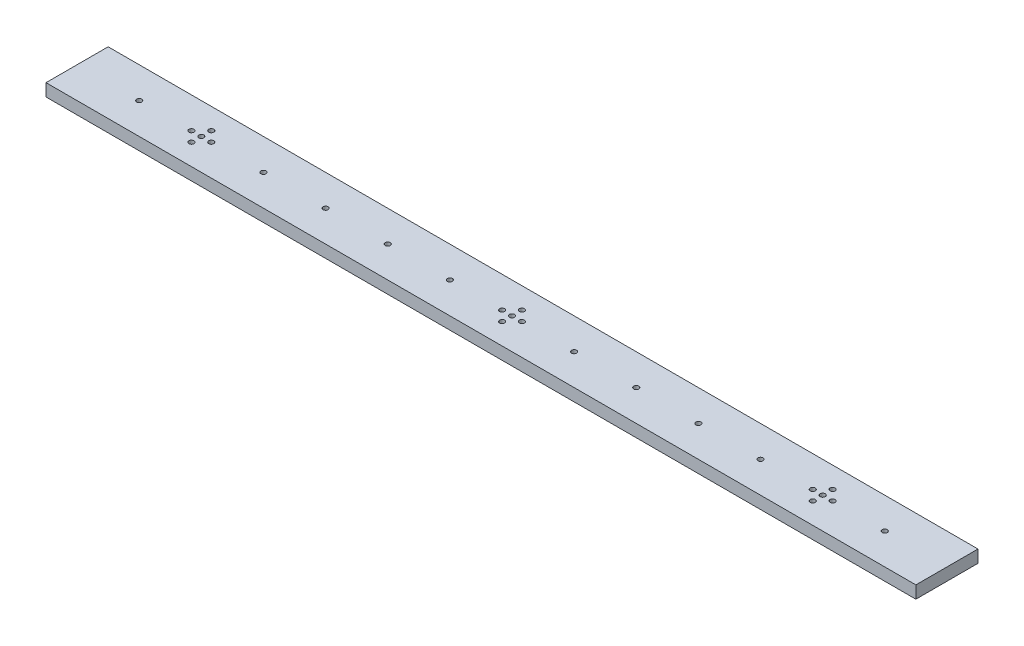
ISO-10303-21;
HEADER;
FILE_DESCRIPTION(('STEP AP214'),'2;1');
FILE_NAME('part.step','',(''),(''),'','','');
FILE_SCHEMA(('AUTOMOTIVE_DESIGN { 1 0 10303 214 1 1 1 1 }'));
ENDSEC;
DATA;
#1=APPLICATION_CONTEXT('core data for automotive mechanical design processes');
#2=APPLICATION_PROTOCOL_DEFINITION('international standard','automotive_design',2000,#1);
#3=PRODUCT_CONTEXT('',#1,'mechanical');
#4=PRODUCT('Part','Part','',(#3));
#5=PRODUCT_RELATED_PRODUCT_CATEGORY('part','',(#4));
#6=PRODUCT_DEFINITION_FORMATION('','',#4);
#7=PRODUCT_DEFINITION_CONTEXT('part definition',#1,'design');
#8=PRODUCT_DEFINITION('design','',#6,#7);
#9=PRODUCT_DEFINITION_SHAPE('','',#8);
#10=(LENGTH_UNIT() NAMED_UNIT(*) SI_UNIT(.MILLI.,.METRE.));
#11=(NAMED_UNIT(*) PLANE_ANGLE_UNIT() SI_UNIT($,.RADIAN.));
#12=(NAMED_UNIT(*) SI_UNIT($,.STERADIAN.) SOLID_ANGLE_UNIT());
#13=UNCERTAINTY_MEASURE_WITH_UNIT(LENGTH_MEASURE(1.E-05),#10,'distance_accuracy_value','');
#14=(GEOMETRIC_REPRESENTATION_CONTEXT(3) GLOBAL_UNCERTAINTY_ASSIGNED_CONTEXT((#13)) GLOBAL_UNIT_ASSIGNED_CONTEXT((#10,
#11,#12)) REPRESENTATION_CONTEXT('',''));
#15=CARTESIAN_POINT('',(0.,0.,0.));
#16=DIRECTION('',(0.,0.,1.));
#17=DIRECTION('',(1.,0.,0.));
#18=AXIS2_PLACEMENT_3D('',#15,#16,#17);
#19=CARTESIAN_POINT('',(350.,10.,-25.));
#20=DIRECTION('',(-1.,0.,0.));
#21=DIRECTION('',(0.,0.,1.));
#22=AXIS2_PLACEMENT_3D('',#19,#20,#21);
#23=PLANE('',#22);
#24=DIRECTION('',(0.,0.,-1.));
#25=VECTOR('',#24,1.);
#26=CARTESIAN_POINT('',(350.,0.,-25.));
#27=LINE('',#26,#25);
#28=CARTESIAN_POINT('',(350.,0.,25.));
#29=VERTEX_POINT('',#28);
#30=CARTESIAN_POINT('',(350.,0.,-25.));
#31=VERTEX_POINT('',#30);
#32=EDGE_CURVE('E107',#29,#31,#27,.T.);
#33=ORIENTED_EDGE('',*,*,#32,.T.);
#34=DIRECTION('',(0.,-1.,0.));
#35=VECTOR('',#34,1.);
#36=CARTESIAN_POINT('',(350.,10.,-25.));
#37=LINE('',#36,#35);
#38=CARTESIAN_POINT('',(350.,10.,-25.));
#39=VERTEX_POINT('',#38);
#40=EDGE_CURVE('E11',#39,#31,#37,.T.);
#41=ORIENTED_EDGE('',*,*,#40,.F.);
#42=DIRECTION('',(0.,0.,-1.));
#43=VECTOR('',#42,1.);
#44=CARTESIAN_POINT('',(350.,10.,-25.));
#45=LINE('',#44,#43);
#46=CARTESIAN_POINT('',(350.,10.,25.));
#47=VERTEX_POINT('',#46);
#48=EDGE_CURVE('E91',#47,#39,#45,.T.);
#49=ORIENTED_EDGE('',*,*,#48,.F.);
#50=DIRECTION('',(0.,-1.,0.));
#51=VECTOR('',#50,1.);
#52=CARTESIAN_POINT('',(350.,10.,25.));
#53=LINE('',#52,#51);
#54=EDGE_CURVE('E103',#47,#29,#53,.T.);
#55=ORIENTED_EDGE('',*,*,#54,.T.);
#56=EDGE_LOOP('',(#33,#41,#49,#55));
#57=FACE_BOUND('',#56,.T.);
#58=ADVANCED_FACE('F39',(#57),#23,.F.);
#59=CARTESIAN_POINT('',(-350.,10.,-25.));
#60=DIRECTION('',(0.,0.,1.));
#61=DIRECTION('',(1.,0.,0.));
#62=AXIS2_PLACEMENT_3D('',#59,#60,#61);
#63=PLANE('',#62);
#64=DIRECTION('',(-1.,0.,0.));
#65=VECTOR('',#64,1.);
#66=CARTESIAN_POINT('',(-350.,0.,-25.));
#67=LINE('',#66,#65);
#68=CARTESIAN_POINT('',(-350.,0.,-25.));
#69=VERTEX_POINT('',#68);
#70=EDGE_CURVE('E96',#31,#69,#67,.T.);
#71=ORIENTED_EDGE('',*,*,#70,.T.);
#72=DIRECTION('',(0.,-1.,0.));
#73=VECTOR('',#72,1.);
#74=CARTESIAN_POINT('',(-350.,10.,-25.));
#75=LINE('',#74,#73);
#76=CARTESIAN_POINT('',(-350.,10.,-25.));
#77=VERTEX_POINT('',#76);
#78=EDGE_CURVE('E48',#77,#69,#75,.T.);
#79=ORIENTED_EDGE('',*,*,#78,.F.);
#80=DIRECTION('',(-1.,0.,0.));
#81=VECTOR('',#80,1.);
#82=CARTESIAN_POINT('',(-350.,10.,-25.));
#83=LINE('',#82,#81);
#84=EDGE_CURVE('E86',#39,#77,#83,.T.);
#85=ORIENTED_EDGE('',*,*,#84,.F.);
#86=ORIENTED_EDGE('',*,*,#40,.T.);
#87=EDGE_LOOP('',(#71,#79,#85,#86));
#88=FACE_BOUND('',#87,.T.);
#89=ADVANCED_FACE('F95',(#88),#63,.F.);
#90=CARTESIAN_POINT('',(-350.,10.,-25.));
#91=DIRECTION('',(1.,0.,0.));
#92=DIRECTION('',(0.,0.,-1.));
#93=AXIS2_PLACEMENT_3D('',#90,#91,#92);
#94=PLANE('',#93);
#95=DIRECTION('',(0.,0.,1.));
#96=VECTOR('',#95,1.);
#97=CARTESIAN_POINT('',(-350.,0.,-25.));
#98=LINE('',#97,#96);
#99=CARTESIAN_POINT('',(-350.,0.,25.));
#100=VERTEX_POINT('',#99);
#101=EDGE_CURVE('E73',#69,#100,#98,.T.);
#102=ORIENTED_EDGE('',*,*,#101,.T.);
#103=DIRECTION('',(0.,-1.,0.));
#104=VECTOR('',#103,1.);
#105=CARTESIAN_POINT('',(-350.,10.,25.));
#106=LINE('',#105,#104);
#107=CARTESIAN_POINT('',(-350.,10.,25.));
#108=VERTEX_POINT('',#107);
#109=EDGE_CURVE('E98',#108,#100,#106,.T.);
#110=ORIENTED_EDGE('',*,*,#109,.F.);
#111=DIRECTION('',(0.,0.,1.));
#112=VECTOR('',#111,1.);
#113=CARTESIAN_POINT('',(-350.,10.,-25.));
#114=LINE('',#113,#112);
#115=EDGE_CURVE('E89',#77,#108,#114,.T.);
#116=ORIENTED_EDGE('',*,*,#115,.F.);
#117=ORIENTED_EDGE('',*,*,#78,.T.);
#118=EDGE_LOOP('',(#102,#110,#116,#117));
#119=FACE_BOUND('',#118,.T.);
#120=ADVANCED_FACE('F99',(#119),#94,.F.);
#121=CARTESIAN_POINT('',(-350.,10.,25.));
#122=DIRECTION('',(0.,0.,-1.));
#123=DIRECTION('',(-1.,0.,0.));
#124=AXIS2_PLACEMENT_3D('',#121,#122,#123);
#125=PLANE('',#124);
#126=DIRECTION('',(1.,0.,0.));
#127=VECTOR('',#126,1.);
#128=CARTESIAN_POINT('',(-350.,0.,25.));
#129=LINE('',#128,#127);
#130=EDGE_CURVE('E79',#100,#29,#129,.T.);
#131=ORIENTED_EDGE('',*,*,#130,.T.);
#132=ORIENTED_EDGE('',*,*,#54,.F.);
#133=DIRECTION('',(1.,0.,0.));
#134=VECTOR('',#133,1.);
#135=CARTESIAN_POINT('',(-350.,10.,25.));
#136=LINE('',#135,#134);
#137=EDGE_CURVE('E56',#108,#47,#136,.T.);
#138=ORIENTED_EDGE('',*,*,#137,.F.);
#139=ORIENTED_EDGE('',*,*,#109,.T.);
#140=EDGE_LOOP('',(#131,#132,#138,#139));
#141=FACE_BOUND('',#140,.T.);
#142=ADVANCED_FACE('F121',(#141),#125,.F.);
#143=CARTESIAN_POINT('',(0.,10.,0.));
#144=DIRECTION('',(0.,1.,0.));
#145=DIRECTION('',(0.,0.,1.));
#146=AXIS2_PLACEMENT_3D('',#143,#144,#145);
#147=PLANE('',#146);
#148=CARTESIAN_POINT('',(242.,10.,0.));
#149=DIRECTION('',(0.,1.,0.));
#150=DIRECTION('',(0.,0.,1.));
#151=AXIS2_PLACEMENT_3D('',#148,#149,#150);
#152=CIRCLE('',#151,2.05000000000002);
#153=CARTESIAN_POINT('',(242.,10.,2.05000000000002));
#154=VERTEX_POINT('',#153);
#155=EDGE_CURVE('E281',#154,#154,#152,.T.);
#156=ORIENTED_EDGE('',*,*,#155,.F.);
#157=EDGE_LOOP('',(#156));
#158=FACE_BOUND('',#157,.T.);
#159=CARTESIAN_POINT('',(-250.,10.,-8.));
#160=DIRECTION('',(0.,1.,0.));
#161=DIRECTION('',(0.,0.,1.));
#162=AXIS2_PLACEMENT_3D('',#159,#160,#161);
#163=CIRCLE('',#162,2.04999999999999);
#164=CARTESIAN_POINT('',(-250.,10.,-5.95000000000001));
#165=VERTEX_POINT('',#164);
#166=EDGE_CURVE('E272',#165,#165,#163,.T.);
#167=ORIENTED_EDGE('',*,*,#166,.F.);
#168=EDGE_LOOP('',(#167));
#169=FACE_BOUND('',#168,.T.);
#170=CARTESIAN_POINT('',(-250.,10.,8.));
#171=DIRECTION('',(0.,1.,0.));
#172=DIRECTION('',(0.,0.,1.));
#173=AXIS2_PLACEMENT_3D('',#170,#171,#172);
#174=CIRCLE('',#173,2.04999999999999);
#175=CARTESIAN_POINT('',(-250.,10.,10.05));
#176=VERTEX_POINT('',#175);
#177=EDGE_CURVE('E297',#176,#176,#174,.T.);
#178=ORIENTED_EDGE('',*,*,#177,.F.);
#179=EDGE_LOOP('',(#178));
#180=FACE_BOUND('',#179,.T.);
#181=CARTESIAN_POINT('',(0.,10.,-8.));
#182=DIRECTION('',(0.,1.,0.));
#183=DIRECTION('',(0.,0.,1.));
#184=AXIS2_PLACEMENT_3D('',#181,#182,#183);
#185=CIRCLE('',#184,2.04999999999999);
#186=CARTESIAN_POINT('',(0.,10.,-5.95000000000001));
#187=VERTEX_POINT('',#186);
#188=EDGE_CURVE('E288',#187,#187,#185,.T.);
#189=ORIENTED_EDGE('',*,*,#188,.F.);
#190=EDGE_LOOP('',(#189));
#191=FACE_BOUND('',#190,.T.);
#192=CARTESIAN_POINT('',(-258.,10.,0.));
#193=DIRECTION('',(0.,1.,0.));
#194=DIRECTION('',(0.,0.,1.));
#195=AXIS2_PLACEMENT_3D('',#192,#193,#194);
#196=CIRCLE('',#195,2.05000000000002);
#197=CARTESIAN_POINT('',(-258.,10.,2.05000000000002));
#198=VERTEX_POINT('',#197);
#199=EDGE_CURVE('E249',#198,#198,#196,.T.);
#200=ORIENTED_EDGE('',*,*,#199,.F.);
#201=EDGE_LOOP('',(#200));
#202=FACE_BOUND('',#201,.T.);
#203=CARTESIAN_POINT('',(7.99999999999995,10.,0.));
#204=DIRECTION('',(0.,1.,0.));
#205=DIRECTION('',(0.,0.,1.));
#206=AXIS2_PLACEMENT_3D('',#203,#204,#205);
#207=CIRCLE('',#206,2.04999999999999);
#208=CARTESIAN_POINT('',(7.99999999999995,10.,2.04999999999999));
#209=VERTEX_POINT('',#208);
#210=EDGE_CURVE('E240',#209,#209,#207,.T.);
#211=ORIENTED_EDGE('',*,*,#210,.F.);
#212=EDGE_LOOP('',(#211));
#213=FACE_BOUND('',#212,.T.);
#214=CARTESIAN_POINT('',(-8.00000000000006,10.,0.));
#215=DIRECTION('',(0.,1.,0.));
#216=DIRECTION('',(0.,0.,1.));
#217=AXIS2_PLACEMENT_3D('',#214,#215,#216);
#218=CIRCLE('',#217,2.05000000000002);
#219=CARTESIAN_POINT('',(-8.00000000000006,10.,2.05000000000002));
#220=VERTEX_POINT('',#219);
#221=EDGE_CURVE('E265',#220,#220,#218,.T.);
#222=ORIENTED_EDGE('',*,*,#221,.F.);
#223=EDGE_LOOP('',(#222));
#224=FACE_BOUND('',#223,.T.);
#225=CARTESIAN_POINT('',(258.,10.,0.));
#226=DIRECTION('',(0.,1.,0.));
#227=DIRECTION('',(0.,0.,1.));
#228=AXIS2_PLACEMENT_3D('',#225,#226,#227);
#229=CIRCLE('',#228,2.04999999999996);
#230=CARTESIAN_POINT('',(258.,10.,2.04999999999996));
#231=VERTEX_POINT('',#230);
#232=EDGE_CURVE('E256',#231,#231,#229,.T.);
#233=ORIENTED_EDGE('',*,*,#232,.F.);
#234=EDGE_LOOP('',(#233));
#235=FACE_BOUND('',#234,.T.);
#236=CARTESIAN_POINT('',(250.,10.,8.));
#237=DIRECTION('',(0.,1.,0.));
#238=DIRECTION('',(0.,0.,1.));
#239=AXIS2_PLACEMENT_3D('',#236,#237,#238);
#240=CIRCLE('',#239,2.04999999999997);
#241=CARTESIAN_POINT('',(250.,10.,10.05));
#242=VERTEX_POINT('',#241);
#243=EDGE_CURVE('E320',#242,#242,#240,.T.);
#244=ORIENTED_EDGE('',*,*,#243,.F.);
#245=EDGE_LOOP('',(#244));
#246=FACE_BOUND('',#245,.T.);
#247=CARTESIAN_POINT('',(250.,10.,-8.));
#248=DIRECTION('',(0.,1.,0.));
#249=DIRECTION('',(0.,0.,1.));
#250=AXIS2_PLACEMENT_3D('',#247,#248,#249);
#251=CIRCLE('',#250,2.04999999999997);
#252=CARTESIAN_POINT('',(250.,10.,-5.95000000000003));
#253=VERTEX_POINT('',#252);
#254=EDGE_CURVE('E304',#253,#253,#251,.T.);
#255=ORIENTED_EDGE('',*,*,#254,.F.);
#256=EDGE_LOOP('',(#255));
#257=FACE_BOUND('',#256,.T.);
#258=CARTESIAN_POINT('',(0.,10.,8.));
#259=DIRECTION('',(0.,1.,0.));
#260=DIRECTION('',(0.,0.,1.));
#261=AXIS2_PLACEMENT_3D('',#258,#259,#260);
#262=CIRCLE('',#261,2.04999999999999);
#263=CARTESIAN_POINT('',(0.,10.,10.05));
#264=VERTEX_POINT('',#263);
#265=EDGE_CURVE('E313',#264,#264,#262,.T.);
#266=ORIENTED_EDGE('',*,*,#265,.F.);
#267=EDGE_LOOP('',(#266));
#268=FACE_BOUND('',#267,.T.);
#269=CARTESIAN_POINT('',(-242.,10.,0.));
#270=DIRECTION('',(0.,1.,0.));
#271=DIRECTION('',(0.,0.,1.));
#272=AXIS2_PLACEMENT_3D('',#269,#270,#271);
#273=CIRCLE('',#272,2.04999999999999);
#274=CARTESIAN_POINT('',(-242.,10.,2.04999999999999));
#275=VERTEX_POINT('',#274);
#276=EDGE_CURVE('E232',#275,#275,#273,.T.);
#277=ORIENTED_EDGE('',*,*,#276,.F.);
#278=EDGE_LOOP('',(#277));
#279=FACE_BOUND('',#278,.T.);
#280=CARTESIAN_POINT('',(-300.,10.,0.));
#281=DIRECTION('',(0.,1.,0.));
#282=DIRECTION('',(0.,0.,1.));
#283=AXIS2_PLACEMENT_3D('',#280,#281,#282);
#284=CIRCLE('',#283,2.05000000000002);
#285=CARTESIAN_POINT('',(-300.,10.,2.05000000000002));
#286=VERTEX_POINT('',#285);
#287=EDGE_CURVE('E225',#286,#286,#284,.T.);
#288=ORIENTED_EDGE('',*,*,#287,.F.);
#289=EDGE_LOOP('',(#288));
#290=FACE_BOUND('',#289,.T.);
#291=CARTESIAN_POINT('',(-250.,10.,0.));
#292=DIRECTION('',(0.,1.,0.));
#293=DIRECTION('',(0.,0.,1.));
#294=AXIS2_PLACEMENT_3D('',#291,#292,#293);
#295=CIRCLE('',#294,2.04999999999999);
#296=CARTESIAN_POINT('',(-250.,10.,2.04999999999999));
#297=VERTEX_POINT('',#296);
#298=EDGE_CURVE('E217',#297,#297,#295,.T.);
#299=ORIENTED_EDGE('',*,*,#298,.F.);
#300=EDGE_LOOP('',(#299));
#301=FACE_BOUND('',#300,.T.);
#302=CARTESIAN_POINT('',(-200.,10.,0.));
#303=DIRECTION('',(0.,1.,0.));
#304=DIRECTION('',(0.,0.,1.));
#305=AXIS2_PLACEMENT_3D('',#302,#303,#304);
#306=CIRCLE('',#305,2.04999999999999);
#307=CARTESIAN_POINT('',(-200.,10.,2.04999999999999));
#308=VERTEX_POINT('',#307);
#309=EDGE_CURVE('E209',#308,#308,#306,.T.);
#310=ORIENTED_EDGE('',*,*,#309,.F.);
#311=EDGE_LOOP('',(#310));
#312=FACE_BOUND('',#311,.T.);
#313=CARTESIAN_POINT('',(-150.,10.,0.));
#314=DIRECTION('',(0.,1.,0.));
#315=DIRECTION('',(0.,0.,1.));
#316=AXIS2_PLACEMENT_3D('',#313,#314,#315);
#317=CIRCLE('',#316,2.04999999999999);
#318=CARTESIAN_POINT('',(-150.,10.,2.04999999999999));
#319=VERTEX_POINT('',#318);
#320=EDGE_CURVE('E201',#319,#319,#317,.T.);
#321=ORIENTED_EDGE('',*,*,#320,.F.);
#322=EDGE_LOOP('',(#321));
#323=FACE_BOUND('',#322,.T.);
#324=CARTESIAN_POINT('',(-100.,10.,0.));
#325=DIRECTION('',(0.,1.,0.));
#326=DIRECTION('',(0.,0.,1.));
#327=AXIS2_PLACEMENT_3D('',#324,#325,#326);
#328=CIRCLE('',#327,2.04999999999999);
#329=CARTESIAN_POINT('',(-100.,10.,2.04999999999999));
#330=VERTEX_POINT('',#329);
#331=EDGE_CURVE('E193',#330,#330,#328,.T.);
#332=ORIENTED_EDGE('',*,*,#331,.F.);
#333=EDGE_LOOP('',(#332));
#334=FACE_BOUND('',#333,.T.);
#335=CARTESIAN_POINT('',(-50.0000000000002,10.,0.));
#336=DIRECTION('',(0.,1.,0.));
#337=DIRECTION('',(0.,0.,1.));
#338=AXIS2_PLACEMENT_3D('',#335,#336,#337);
#339=CIRCLE('',#338,2.04999999999999);
#340=CARTESIAN_POINT('',(-50.0000000000002,10.,2.04999999999999));
#341=VERTEX_POINT('',#340);
#342=EDGE_CURVE('E185',#341,#341,#339,.T.);
#343=ORIENTED_EDGE('',*,*,#342,.F.);
#344=EDGE_LOOP('',(#343));
#345=FACE_BOUND('',#344,.T.);
#346=CARTESIAN_POINT('',(-1.66533453693773E-13,10.,0.));
#347=DIRECTION('',(0.,1.,0.));
#348=DIRECTION('',(0.,0.,1.));
#349=AXIS2_PLACEMENT_3D('',#346,#347,#348);
#350=CIRCLE('',#349,2.05);
#351=CARTESIAN_POINT('',(-1.66533453693773E-13,10.,2.05));
#352=VERTEX_POINT('',#351);
#353=EDGE_CURVE('E177',#352,#352,#350,.T.);
#354=ORIENTED_EDGE('',*,*,#353,.F.);
#355=EDGE_LOOP('',(#354));
#356=FACE_BOUND('',#355,.T.);
#357=CARTESIAN_POINT('',(49.9999999999998,10.,0.));
#358=DIRECTION('',(0.,1.,0.));
#359=DIRECTION('',(0.,0.,1.));
#360=AXIS2_PLACEMENT_3D('',#357,#358,#359);
#361=CIRCLE('',#360,2.04999999999999);
#362=CARTESIAN_POINT('',(49.9999999999998,10.,2.04999999999999));
#363=VERTEX_POINT('',#362);
#364=EDGE_CURVE('E169',#363,#363,#361,.T.);
#365=ORIENTED_EDGE('',*,*,#364,.F.);
#366=EDGE_LOOP('',(#365));
#367=FACE_BOUND('',#366,.T.);
#368=CARTESIAN_POINT('',(99.9999999999998,10.,0.));
#369=DIRECTION('',(0.,1.,0.));
#370=DIRECTION('',(0.,0.,1.));
#371=AXIS2_PLACEMENT_3D('',#368,#369,#370);
#372=CIRCLE('',#371,2.04999999999999);
#373=CARTESIAN_POINT('',(99.9999999999998,10.,2.04999999999999));
#374=VERTEX_POINT('',#373);
#375=EDGE_CURVE('E161',#374,#374,#372,.T.);
#376=ORIENTED_EDGE('',*,*,#375,.F.);
#377=EDGE_LOOP('',(#376));
#378=FACE_BOUND('',#377,.T.);
#379=CARTESIAN_POINT('',(150.,10.,0.));
#380=DIRECTION('',(0.,1.,0.));
#381=DIRECTION('',(0.,0.,1.));
#382=AXIS2_PLACEMENT_3D('',#379,#380,#381);
#383=CIRCLE('',#382,2.04999999999999);
#384=CARTESIAN_POINT('',(150.,10.,2.04999999999999));
#385=VERTEX_POINT('',#384);
#386=EDGE_CURVE('E153',#385,#385,#383,.T.);
#387=ORIENTED_EDGE('',*,*,#386,.F.);
#388=EDGE_LOOP('',(#387));
#389=FACE_BOUND('',#388,.T.);
#390=CARTESIAN_POINT('',(200.,10.,0.));
#391=DIRECTION('',(0.,1.,0.));
#392=DIRECTION('',(0.,0.,1.));
#393=AXIS2_PLACEMENT_3D('',#390,#391,#392);
#394=CIRCLE('',#393,2.04999999999999);
#395=CARTESIAN_POINT('',(200.,10.,2.04999999999999));
#396=VERTEX_POINT('',#395);
#397=EDGE_CURVE('E145',#396,#396,#394,.T.);
#398=ORIENTED_EDGE('',*,*,#397,.F.);
#399=EDGE_LOOP('',(#398));
#400=FACE_BOUND('',#399,.T.);
#401=CARTESIAN_POINT('',(250.,10.,0.));
#402=DIRECTION('',(0.,1.,0.));
#403=DIRECTION('',(0.,0.,1.));
#404=AXIS2_PLACEMENT_3D('',#401,#402,#403);
#405=CIRCLE('',#404,2.05000000000002);
#406=CARTESIAN_POINT('',(250.,10.,2.05000000000002));
#407=VERTEX_POINT('',#406);
#408=EDGE_CURVE('E137',#407,#407,#405,.T.);
#409=ORIENTED_EDGE('',*,*,#408,.F.);
#410=EDGE_LOOP('',(#409));
#411=FACE_BOUND('',#410,.T.);
#412=CARTESIAN_POINT('',(300.,10.,0.));
#413=DIRECTION('',(0.,1.,0.));
#414=DIRECTION('',(0.,0.,1.));
#415=AXIS2_PLACEMENT_3D('',#412,#413,#414);
#416=CIRCLE('',#415,2.05000000000002);
#417=CARTESIAN_POINT('',(300.,10.,2.05000000000002));
#418=VERTEX_POINT('',#417);
#419=EDGE_CURVE('E128',#418,#418,#416,.T.);
#420=ORIENTED_EDGE('',*,*,#419,.F.);
#421=EDGE_LOOP('',(#420));
#422=FACE_BOUND('',#421,.T.);
#423=ORIENTED_EDGE('',*,*,#48,.T.);
#424=ORIENTED_EDGE('',*,*,#84,.T.);
#425=ORIENTED_EDGE('',*,*,#115,.T.);
#426=ORIENTED_EDGE('',*,*,#137,.T.);
#427=EDGE_LOOP('',(#423,#424,#425,#426));
#428=FACE_BOUND('',#427,.T.);
#429=ADVANCED_FACE('F87',(#158,#169,#180,#191,#202,#213,#224,#235,#246,#257,#268,#279,#290,#301,
#312,#323,#334,#345,#356,#367,#378,#389,#400,#411,#422,#428),#147,.T.);
#430=CARTESIAN_POINT('',(0.,0.,0.));
#431=DIRECTION('',(0.,1.,0.));
#432=DIRECTION('',(0.,0.,1.));
#433=AXIS2_PLACEMENT_3D('',#430,#431,#432);
#434=PLANE('',#433);
#435=CARTESIAN_POINT('',(242.,0.,0.));
#436=DIRECTION('',(0.,1.,0.));
#437=DIRECTION('',(0.,0.,1.));
#438=AXIS2_PLACEMENT_3D('',#435,#436,#437);
#439=CIRCLE('',#438,2.05000000000002);
#440=CARTESIAN_POINT('',(242.,0.,2.05000000000002));
#441=VERTEX_POINT('',#440);
#442=EDGE_CURVE('E261',#441,#441,#439,.T.);
#443=ORIENTED_EDGE('',*,*,#442,.T.);
#444=EDGE_LOOP('',(#443));
#445=FACE_BOUND('',#444,.T.);
#446=CARTESIAN_POINT('',(-250.,0.,-8.));
#447=DIRECTION('',(0.,1.,0.));
#448=DIRECTION('',(0.,0.,1.));
#449=AXIS2_PLACEMENT_3D('',#446,#447,#448);
#450=CIRCLE('',#449,2.04999999999999);
#451=CARTESIAN_POINT('',(-250.,0.,-5.95000000000001));
#452=VERTEX_POINT('',#451);
#453=EDGE_CURVE('E276',#452,#452,#450,.T.);
#454=ORIENTED_EDGE('',*,*,#453,.T.);
#455=EDGE_LOOP('',(#454));
#456=FACE_BOUND('',#455,.T.);
#457=CARTESIAN_POINT('',(-250.,0.,8.));
#458=DIRECTION('',(0.,1.,0.));
#459=DIRECTION('',(0.,0.,1.));
#460=AXIS2_PLACEMENT_3D('',#457,#458,#459);
#461=CIRCLE('',#460,2.04999999999999);
#462=CARTESIAN_POINT('',(-250.,0.,10.05));
#463=VERTEX_POINT('',#462);
#464=EDGE_CURVE('E277',#463,#463,#461,.T.);
#465=ORIENTED_EDGE('',*,*,#464,.T.);
#466=EDGE_LOOP('',(#465));
#467=FACE_BOUND('',#466,.T.);
#468=CARTESIAN_POINT('',(0.,0.,-8.));
#469=DIRECTION('',(0.,1.,0.));
#470=DIRECTION('',(0.,0.,1.));
#471=AXIS2_PLACEMENT_3D('',#468,#469,#470);
#472=CIRCLE('',#471,2.04999999999999);
#473=CARTESIAN_POINT('',(0.,0.,-5.95000000000001));
#474=VERTEX_POINT('',#473);
#475=EDGE_CURVE('E292',#474,#474,#472,.T.);
#476=ORIENTED_EDGE('',*,*,#475,.T.);
#477=EDGE_LOOP('',(#476));
#478=FACE_BOUND('',#477,.T.);
#479=CARTESIAN_POINT('',(-258.,0.,0.));
#480=DIRECTION('',(0.,1.,0.));
#481=DIRECTION('',(0.,0.,1.));
#482=AXIS2_PLACEMENT_3D('',#479,#480,#481);
#483=CIRCLE('',#482,2.05000000000002);
#484=CARTESIAN_POINT('',(-258.,0.,2.05000000000002));
#485=VERTEX_POINT('',#484);
#486=EDGE_CURVE('E236',#485,#485,#483,.T.);
#487=ORIENTED_EDGE('',*,*,#486,.T.);
#488=EDGE_LOOP('',(#487));
#489=FACE_BOUND('',#488,.T.);
#490=CARTESIAN_POINT('',(7.99999999999995,0.,0.));
#491=DIRECTION('',(0.,1.,0.));
#492=DIRECTION('',(0.,0.,1.));
#493=AXIS2_PLACEMENT_3D('',#490,#491,#492);
#494=CIRCLE('',#493,2.04999999999999);
#495=CARTESIAN_POINT('',(7.99999999999995,0.,2.04999999999999));
#496=VERTEX_POINT('',#495);
#497=EDGE_CURVE('E244',#496,#496,#494,.T.);
#498=ORIENTED_EDGE('',*,*,#497,.T.);
#499=EDGE_LOOP('',(#498));
#500=FACE_BOUND('',#499,.T.);
#501=CARTESIAN_POINT('',(-8.00000000000006,0.,0.));
#502=DIRECTION('',(0.,1.,0.));
#503=DIRECTION('',(0.,0.,1.));
#504=AXIS2_PLACEMENT_3D('',#501,#502,#503);
#505=CIRCLE('',#504,2.05000000000002);
#506=CARTESIAN_POINT('',(-8.00000000000006,0.,2.05000000000002));
#507=VERTEX_POINT('',#506);
#508=EDGE_CURVE('E245',#507,#507,#505,.T.);
#509=ORIENTED_EDGE('',*,*,#508,.T.);
#510=EDGE_LOOP('',(#509));
#511=FACE_BOUND('',#510,.T.);
#512=CARTESIAN_POINT('',(258.,0.,0.));
#513=DIRECTION('',(0.,1.,0.));
#514=DIRECTION('',(0.,0.,1.));
#515=AXIS2_PLACEMENT_3D('',#512,#513,#514);
#516=CIRCLE('',#515,2.04999999999996);
#517=CARTESIAN_POINT('',(258.,0.,2.04999999999996));
#518=VERTEX_POINT('',#517);
#519=EDGE_CURVE('E260',#518,#518,#516,.T.);
#520=ORIENTED_EDGE('',*,*,#519,.T.);
#521=EDGE_LOOP('',(#520));
#522=FACE_BOUND('',#521,.T.);
#523=CARTESIAN_POINT('',(250.,0.,8.));
#524=DIRECTION('',(0.,1.,0.));
#525=DIRECTION('',(0.,0.,1.));
#526=AXIS2_PLACEMENT_3D('',#523,#524,#525);
#527=CIRCLE('',#526,2.04999999999997);
#528=CARTESIAN_POINT('',(250.,0.,10.05));
#529=VERTEX_POINT('',#528);
#530=EDGE_CURVE('E309',#529,#529,#527,.T.);
#531=ORIENTED_EDGE('',*,*,#530,.T.);
#532=EDGE_LOOP('',(#531));
#533=FACE_BOUND('',#532,.T.);
#534=CARTESIAN_POINT('',(250.,0.,-8.));
#535=DIRECTION('',(0.,1.,0.));
#536=DIRECTION('',(0.,0.,1.));
#537=AXIS2_PLACEMENT_3D('',#534,#535,#536);
#538=CIRCLE('',#537,2.04999999999997);
#539=CARTESIAN_POINT('',(250.,0.,-5.95000000000003));
#540=VERTEX_POINT('',#539);
#541=EDGE_CURVE('E308',#540,#540,#538,.T.);
#542=ORIENTED_EDGE('',*,*,#541,.T.);
#543=EDGE_LOOP('',(#542));
#544=FACE_BOUND('',#543,.T.);
#545=CARTESIAN_POINT('',(0.,0.,8.));
#546=DIRECTION('',(0.,1.,0.));
#547=DIRECTION('',(0.,0.,1.));
#548=AXIS2_PLACEMENT_3D('',#545,#546,#547);
#549=CIRCLE('',#548,2.04999999999999);
#550=CARTESIAN_POINT('',(0.,0.,10.05));
#551=VERTEX_POINT('',#550);
#552=EDGE_CURVE('E293',#551,#551,#549,.T.);
#553=ORIENTED_EDGE('',*,*,#552,.T.);
#554=EDGE_LOOP('',(#553));
#555=FACE_BOUND('',#554,.T.);
#556=CARTESIAN_POINT('',(-242.,0.,0.));
#557=DIRECTION('',(0.,1.,0.));
#558=DIRECTION('',(0.,0.,1.));
#559=AXIS2_PLACEMENT_3D('',#556,#557,#558);
#560=CIRCLE('',#559,2.04999999999999);
#561=CARTESIAN_POINT('',(-242.,0.,2.04999999999999));
#562=VERTEX_POINT('',#561);
#563=EDGE_CURVE('E133',#562,#562,#560,.T.);
#564=ORIENTED_EDGE('',*,*,#563,.T.);
#565=EDGE_LOOP('',(#564));
#566=FACE_BOUND('',#565,.T.);
#567=CARTESIAN_POINT('',(-300.,0.,0.));
#568=DIRECTION('',(0.,1.,0.));
#569=DIRECTION('',(0.,0.,1.));
#570=AXIS2_PLACEMENT_3D('',#567,#568,#569);
#571=CIRCLE('',#570,2.05000000000002);
#572=CARTESIAN_POINT('',(-300.,0.,2.05000000000002));
#573=VERTEX_POINT('',#572);
#574=EDGE_CURVE('E111',#573,#573,#571,.T.);
#575=ORIENTED_EDGE('',*,*,#574,.T.);
#576=EDGE_LOOP('',(#575));
#577=FACE_BOUND('',#576,.T.);
#578=CARTESIAN_POINT('',(-250.,0.,0.));
#579=DIRECTION('',(0.,1.,0.));
#580=DIRECTION('',(0.,0.,1.));
#581=AXIS2_PLACEMENT_3D('',#578,#579,#580);
#582=CIRCLE('',#581,2.04999999999999);
#583=CARTESIAN_POINT('',(-250.,0.,2.04999999999999));
#584=VERTEX_POINT('',#583);
#585=EDGE_CURVE('E221',#584,#584,#582,.T.);
#586=ORIENTED_EDGE('',*,*,#585,.T.);
#587=EDGE_LOOP('',(#586));
#588=FACE_BOUND('',#587,.T.);
#589=CARTESIAN_POINT('',(-200.,0.,0.));
#590=DIRECTION('',(0.,1.,0.));
#591=DIRECTION('',(0.,0.,1.));
#592=AXIS2_PLACEMENT_3D('',#589,#590,#591);
#593=CIRCLE('',#592,2.04999999999999);
#594=CARTESIAN_POINT('',(-200.,0.,2.04999999999999));
#595=VERTEX_POINT('',#594);
#596=EDGE_CURVE('E213',#595,#595,#593,.T.);
#597=ORIENTED_EDGE('',*,*,#596,.T.);
#598=EDGE_LOOP('',(#597));
#599=FACE_BOUND('',#598,.T.);
#600=CARTESIAN_POINT('',(-150.,0.,0.));
#601=DIRECTION('',(0.,1.,0.));
#602=DIRECTION('',(0.,0.,1.));
#603=AXIS2_PLACEMENT_3D('',#600,#601,#602);
#604=CIRCLE('',#603,2.04999999999999);
#605=CARTESIAN_POINT('',(-150.,0.,2.04999999999999));
#606=VERTEX_POINT('',#605);
#607=EDGE_CURVE('E205',#606,#606,#604,.T.);
#608=ORIENTED_EDGE('',*,*,#607,.T.);
#609=EDGE_LOOP('',(#608));
#610=FACE_BOUND('',#609,.T.);
#611=CARTESIAN_POINT('',(-100.,0.,0.));
#612=DIRECTION('',(0.,1.,0.));
#613=DIRECTION('',(0.,0.,1.));
#614=AXIS2_PLACEMENT_3D('',#611,#612,#613);
#615=CIRCLE('',#614,2.04999999999999);
#616=CARTESIAN_POINT('',(-100.,0.,2.04999999999999));
#617=VERTEX_POINT('',#616);
#618=EDGE_CURVE('E197',#617,#617,#615,.T.);
#619=ORIENTED_EDGE('',*,*,#618,.T.);
#620=EDGE_LOOP('',(#619));
#621=FACE_BOUND('',#620,.T.);
#622=CARTESIAN_POINT('',(-50.0000000000002,0.,0.));
#623=DIRECTION('',(0.,1.,0.));
#624=DIRECTION('',(0.,0.,1.));
#625=AXIS2_PLACEMENT_3D('',#622,#623,#624);
#626=CIRCLE('',#625,2.04999999999999);
#627=CARTESIAN_POINT('',(-50.0000000000002,0.,2.04999999999999));
#628=VERTEX_POINT('',#627);
#629=EDGE_CURVE('E189',#628,#628,#626,.T.);
#630=ORIENTED_EDGE('',*,*,#629,.T.);
#631=EDGE_LOOP('',(#630));
#632=FACE_BOUND('',#631,.T.);
#633=CARTESIAN_POINT('',(-1.66533453693773E-13,0.,0.));
#634=DIRECTION('',(0.,1.,0.));
#635=DIRECTION('',(0.,0.,1.));
#636=AXIS2_PLACEMENT_3D('',#633,#634,#635);
#637=CIRCLE('',#636,2.05);
#638=CARTESIAN_POINT('',(-1.66533453693773E-13,0.,2.05));
#639=VERTEX_POINT('',#638);
#640=EDGE_CURVE('E181',#639,#639,#637,.T.);
#641=ORIENTED_EDGE('',*,*,#640,.T.);
#642=EDGE_LOOP('',(#641));
#643=FACE_BOUND('',#642,.T.);
#644=CARTESIAN_POINT('',(49.9999999999998,0.,0.));
#645=DIRECTION('',(0.,1.,0.));
#646=DIRECTION('',(0.,0.,1.));
#647=AXIS2_PLACEMENT_3D('',#644,#645,#646);
#648=CIRCLE('',#647,2.04999999999999);
#649=CARTESIAN_POINT('',(49.9999999999998,0.,2.04999999999999));
#650=VERTEX_POINT('',#649);
#651=EDGE_CURVE('E173',#650,#650,#648,.T.);
#652=ORIENTED_EDGE('',*,*,#651,.T.);
#653=EDGE_LOOP('',(#652));
#654=FACE_BOUND('',#653,.T.);
#655=CARTESIAN_POINT('',(99.9999999999998,0.,0.));
#656=DIRECTION('',(0.,1.,0.));
#657=DIRECTION('',(0.,0.,1.));
#658=AXIS2_PLACEMENT_3D('',#655,#656,#657);
#659=CIRCLE('',#658,2.04999999999999);
#660=CARTESIAN_POINT('',(99.9999999999998,0.,2.04999999999999));
#661=VERTEX_POINT('',#660);
#662=EDGE_CURVE('E165',#661,#661,#659,.T.);
#663=ORIENTED_EDGE('',*,*,#662,.T.);
#664=EDGE_LOOP('',(#663));
#665=FACE_BOUND('',#664,.T.);
#666=CARTESIAN_POINT('',(150.,0.,0.));
#667=DIRECTION('',(0.,1.,0.));
#668=DIRECTION('',(0.,0.,1.));
#669=AXIS2_PLACEMENT_3D('',#666,#667,#668);
#670=CIRCLE('',#669,2.04999999999999);
#671=CARTESIAN_POINT('',(150.,0.,2.04999999999999));
#672=VERTEX_POINT('',#671);
#673=EDGE_CURVE('E157',#672,#672,#670,.T.);
#674=ORIENTED_EDGE('',*,*,#673,.T.);
#675=EDGE_LOOP('',(#674));
#676=FACE_BOUND('',#675,.T.);
#677=CARTESIAN_POINT('',(200.,0.,0.));
#678=DIRECTION('',(0.,1.,0.));
#679=DIRECTION('',(0.,0.,1.));
#680=AXIS2_PLACEMENT_3D('',#677,#678,#679);
#681=CIRCLE('',#680,2.04999999999999);
#682=CARTESIAN_POINT('',(200.,0.,2.04999999999999));
#683=VERTEX_POINT('',#682);
#684=EDGE_CURVE('E149',#683,#683,#681,.T.);
#685=ORIENTED_EDGE('',*,*,#684,.T.);
#686=EDGE_LOOP('',(#685));
#687=FACE_BOUND('',#686,.T.);
#688=CARTESIAN_POINT('',(250.,0.,0.));
#689=DIRECTION('',(0.,1.,0.));
#690=DIRECTION('',(0.,0.,1.));
#691=AXIS2_PLACEMENT_3D('',#688,#689,#690);
#692=CIRCLE('',#691,2.05000000000002);
#693=CARTESIAN_POINT('',(250.,0.,2.05000000000002));
#694=VERTEX_POINT('',#693);
#695=EDGE_CURVE('E141',#694,#694,#692,.T.);
#696=ORIENTED_EDGE('',*,*,#695,.T.);
#697=EDGE_LOOP('',(#696));
#698=FACE_BOUND('',#697,.T.);
#699=CARTESIAN_POINT('',(300.,0.,0.));
#700=DIRECTION('',(0.,1.,0.));
#701=DIRECTION('',(0.,0.,1.));
#702=AXIS2_PLACEMENT_3D('',#699,#700,#701);
#703=CIRCLE('',#702,2.05000000000002);
#704=CARTESIAN_POINT('',(300.,0.,2.05000000000002));
#705=VERTEX_POINT('',#704);
#706=EDGE_CURVE('E132',#705,#705,#703,.T.);
#707=ORIENTED_EDGE('',*,*,#706,.T.);
#708=EDGE_LOOP('',(#707));
#709=FACE_BOUND('',#708,.T.);
#710=ORIENTED_EDGE('',*,*,#32,.F.);
#711=ORIENTED_EDGE('',*,*,#130,.F.);
#712=ORIENTED_EDGE('',*,*,#101,.F.);
#713=ORIENTED_EDGE('',*,*,#70,.F.);
#714=EDGE_LOOP('',(#710,#711,#712,#713));
#715=FACE_BOUND('',#714,.T.);
#716=ADVANCED_FACE('F124',(#445,#456,#467,#478,#489,#500,#511,#522,#533,#544,#555,#566,#577,
#588,#599,#610,#621,#632,#643,#654,#665,#676,#687,#698,#709,#715),#434,.F.);
#717=CARTESIAN_POINT('',(300.,0.,0.));
#718=DIRECTION('',(0.,1.,0.));
#719=DIRECTION('',(0.,0.,1.));
#720=AXIS2_PLACEMENT_3D('',#717,#718,#719);
#721=CYLINDRICAL_SURFACE('',#720,2.05000000000002);
#722=ORIENTED_EDGE('',*,*,#706,.F.);
#723=EDGE_LOOP('',(#722));
#724=FACE_BOUND('',#723,.T.);
#725=ORIENTED_EDGE('',*,*,#419,.T.);
#726=EDGE_LOOP('',(#725));
#727=FACE_BOUND('',#726,.T.);
#728=ADVANCED_FACE('F374',(#724,#727),#721,.F.);
#729=CARTESIAN_POINT('',(250.,0.,0.));
#730=DIRECTION('',(0.,1.,0.));
#731=DIRECTION('',(0.,0.,1.));
#732=AXIS2_PLACEMENT_3D('',#729,#730,#731);
#733=CYLINDRICAL_SURFACE('',#732,2.05000000000002);
#734=ORIENTED_EDGE('',*,*,#695,.F.);
#735=EDGE_LOOP('',(#734));
#736=FACE_BOUND('',#735,.T.);
#737=ORIENTED_EDGE('',*,*,#408,.T.);
#738=EDGE_LOOP('',(#737));
#739=FACE_BOUND('',#738,.T.);
#740=ADVANCED_FACE('F376',(#736,#739),#733,.F.);
#741=CARTESIAN_POINT('',(200.,0.,0.));
#742=DIRECTION('',(0.,1.,0.));
#743=DIRECTION('',(0.,0.,1.));
#744=AXIS2_PLACEMENT_3D('',#741,#742,#743);
#745=CYLINDRICAL_SURFACE('',#744,2.04999999999999);
#746=ORIENTED_EDGE('',*,*,#684,.F.);
#747=EDGE_LOOP('',(#746));
#748=FACE_BOUND('',#747,.T.);
#749=ORIENTED_EDGE('',*,*,#397,.T.);
#750=EDGE_LOOP('',(#749));
#751=FACE_BOUND('',#750,.T.);
#752=ADVANCED_FACE('F383',(#748,#751),#745,.F.);
#753=CARTESIAN_POINT('',(150.,0.,0.));
#754=DIRECTION('',(0.,1.,0.));
#755=DIRECTION('',(0.,0.,1.));
#756=AXIS2_PLACEMENT_3D('',#753,#754,#755);
#757=CYLINDRICAL_SURFACE('',#756,2.04999999999999);
#758=ORIENTED_EDGE('',*,*,#673,.F.);
#759=EDGE_LOOP('',(#758));
#760=FACE_BOUND('',#759,.T.);
#761=ORIENTED_EDGE('',*,*,#386,.T.);
#762=EDGE_LOOP('',(#761));
#763=FACE_BOUND('',#762,.T.);
#764=ADVANCED_FACE('F570',(#760,#763),#757,.F.);
#765=CARTESIAN_POINT('',(99.9999999999998,0.,0.));
#766=DIRECTION('',(0.,1.,0.));
#767=DIRECTION('',(0.,0.,1.));
#768=AXIS2_PLACEMENT_3D('',#765,#766,#767);
#769=CYLINDRICAL_SURFACE('',#768,2.04999999999999);
#770=ORIENTED_EDGE('',*,*,#662,.F.);
#771=EDGE_LOOP('',(#770));
#772=FACE_BOUND('',#771,.T.);
#773=ORIENTED_EDGE('',*,*,#375,.T.);
#774=EDGE_LOOP('',(#773));
#775=FACE_BOUND('',#774,.T.);
#776=ADVANCED_FACE('F566',(#772,#775),#769,.F.);
#777=CARTESIAN_POINT('',(49.9999999999998,0.,0.));
#778=DIRECTION('',(0.,1.,0.));
#779=DIRECTION('',(0.,0.,1.));
#780=AXIS2_PLACEMENT_3D('',#777,#778,#779);
#781=CYLINDRICAL_SURFACE('',#780,2.04999999999999);
#782=ORIENTED_EDGE('',*,*,#651,.F.);
#783=EDGE_LOOP('',(#782));
#784=FACE_BOUND('',#783,.T.);
#785=ORIENTED_EDGE('',*,*,#364,.T.);
#786=EDGE_LOOP('',(#785));
#787=FACE_BOUND('',#786,.T.);
#788=ADVANCED_FACE('F562',(#784,#787),#781,.F.);
#789=CARTESIAN_POINT('',(-1.66533453693773E-13,0.,0.));
#790=DIRECTION('',(0.,1.,0.));
#791=DIRECTION('',(0.,0.,1.));
#792=AXIS2_PLACEMENT_3D('',#789,#790,#791);
#793=CYLINDRICAL_SURFACE('',#792,2.05);
#794=ORIENTED_EDGE('',*,*,#640,.F.);
#795=EDGE_LOOP('',(#794));
#796=FACE_BOUND('',#795,.T.);
#797=ORIENTED_EDGE('',*,*,#353,.T.);
#798=EDGE_LOOP('',(#797));
#799=FACE_BOUND('',#798,.T.);
#800=ADVANCED_FACE('F558',(#796,#799),#793,.F.);
#801=CARTESIAN_POINT('',(-50.0000000000002,0.,0.));
#802=DIRECTION('',(0.,1.,0.));
#803=DIRECTION('',(0.,0.,1.));
#804=AXIS2_PLACEMENT_3D('',#801,#802,#803);
#805=CYLINDRICAL_SURFACE('',#804,2.04999999999999);
#806=ORIENTED_EDGE('',*,*,#629,.F.);
#807=EDGE_LOOP('',(#806));
#808=FACE_BOUND('',#807,.T.);
#809=ORIENTED_EDGE('',*,*,#342,.T.);
#810=EDGE_LOOP('',(#809));
#811=FACE_BOUND('',#810,.T.);
#812=ADVANCED_FACE('F554',(#808,#811),#805,.F.);
#813=CARTESIAN_POINT('',(-100.,0.,0.));
#814=DIRECTION('',(0.,1.,0.));
#815=DIRECTION('',(0.,0.,1.));
#816=AXIS2_PLACEMENT_3D('',#813,#814,#815);
#817=CYLINDRICAL_SURFACE('',#816,2.04999999999999);
#818=ORIENTED_EDGE('',*,*,#618,.F.);
#819=EDGE_LOOP('',(#818));
#820=FACE_BOUND('',#819,.T.);
#821=ORIENTED_EDGE('',*,*,#331,.T.);
#822=EDGE_LOOP('',(#821));
#823=FACE_BOUND('',#822,.T.);
#824=ADVANCED_FACE('F550',(#820,#823),#817,.F.);
#825=CARTESIAN_POINT('',(-150.,0.,0.));
#826=DIRECTION('',(0.,1.,0.));
#827=DIRECTION('',(0.,0.,1.));
#828=AXIS2_PLACEMENT_3D('',#825,#826,#827);
#829=CYLINDRICAL_SURFACE('',#828,2.04999999999999);
#830=ORIENTED_EDGE('',*,*,#607,.F.);
#831=EDGE_LOOP('',(#830));
#832=FACE_BOUND('',#831,.T.);
#833=ORIENTED_EDGE('',*,*,#320,.T.);
#834=EDGE_LOOP('',(#833));
#835=FACE_BOUND('',#834,.T.);
#836=ADVANCED_FACE('F546',(#832,#835),#829,.F.);
#837=CARTESIAN_POINT('',(-200.,0.,0.));
#838=DIRECTION('',(0.,1.,0.));
#839=DIRECTION('',(0.,0.,1.));
#840=AXIS2_PLACEMENT_3D('',#837,#838,#839);
#841=CYLINDRICAL_SURFACE('',#840,2.04999999999999);
#842=ORIENTED_EDGE('',*,*,#596,.F.);
#843=EDGE_LOOP('',(#842));
#844=FACE_BOUND('',#843,.T.);
#845=ORIENTED_EDGE('',*,*,#309,.T.);
#846=EDGE_LOOP('',(#845));
#847=FACE_BOUND('',#846,.T.);
#848=ADVANCED_FACE('F542',(#844,#847),#841,.F.);
#849=CARTESIAN_POINT('',(-250.,0.,0.));
#850=DIRECTION('',(0.,1.,0.));
#851=DIRECTION('',(0.,0.,1.));
#852=AXIS2_PLACEMENT_3D('',#849,#850,#851);
#853=CYLINDRICAL_SURFACE('',#852,2.04999999999999);
#854=ORIENTED_EDGE('',*,*,#585,.F.);
#855=EDGE_LOOP('',(#854));
#856=FACE_BOUND('',#855,.T.);
#857=ORIENTED_EDGE('',*,*,#298,.T.);
#858=EDGE_LOOP('',(#857));
#859=FACE_BOUND('',#858,.T.);
#860=ADVANCED_FACE('F538',(#856,#859),#853,.F.);
#861=CARTESIAN_POINT('',(-300.,0.,0.));
#862=DIRECTION('',(0.,1.,0.));
#863=DIRECTION('',(0.,0.,1.));
#864=AXIS2_PLACEMENT_3D('',#861,#862,#863);
#865=CYLINDRICAL_SURFACE('',#864,2.05000000000002);
#866=ORIENTED_EDGE('',*,*,#574,.F.);
#867=EDGE_LOOP('',(#866));
#868=FACE_BOUND('',#867,.T.);
#869=ORIENTED_EDGE('',*,*,#287,.T.);
#870=EDGE_LOOP('',(#869));
#871=FACE_BOUND('',#870,.T.);
#872=ADVANCED_FACE('F424',(#868,#871),#865,.F.);
#873=CARTESIAN_POINT('',(-242.,0.,0.));
#874=DIRECTION('',(0.,1.,0.));
#875=DIRECTION('',(0.,0.,1.));
#876=AXIS2_PLACEMENT_3D('',#873,#874,#875);
#877=CYLINDRICAL_SURFACE('',#876,2.04999999999999);
#878=ORIENTED_EDGE('',*,*,#563,.F.);
#879=EDGE_LOOP('',(#878));
#880=FACE_BOUND('',#879,.T.);
#881=ORIENTED_EDGE('',*,*,#276,.T.);
#882=EDGE_LOOP('',(#881));
#883=FACE_BOUND('',#882,.T.);
#884=ADVANCED_FACE('F418',(#880,#883),#877,.F.);
#885=CARTESIAN_POINT('',(0.,0.,8.));
#886=DIRECTION('',(0.,1.,0.));
#887=DIRECTION('',(0.,0.,1.));
#888=AXIS2_PLACEMENT_3D('',#885,#886,#887);
#889=CYLINDRICAL_SURFACE('',#888,2.04999999999999);
#890=ORIENTED_EDGE('',*,*,#552,.F.);
#891=EDGE_LOOP('',(#890));
#892=FACE_BOUND('',#891,.T.);
#893=ORIENTED_EDGE('',*,*,#265,.T.);
#894=EDGE_LOOP('',(#893));
#895=FACE_BOUND('',#894,.T.);
#896=ADVANCED_FACE('F423',(#892,#895),#889,.F.);
#897=CARTESIAN_POINT('',(250.,0.,-8.));
#898=DIRECTION('',(0.,1.,0.));
#899=DIRECTION('',(0.,0.,1.));
#900=AXIS2_PLACEMENT_3D('',#897,#898,#899);
#901=CYLINDRICAL_SURFACE('',#900,2.04999999999997);
#902=ORIENTED_EDGE('',*,*,#541,.F.);
#903=EDGE_LOOP('',(#902));
#904=FACE_BOUND('',#903,.T.);
#905=ORIENTED_EDGE('',*,*,#254,.T.);
#906=EDGE_LOOP('',(#905));
#907=FACE_BOUND('',#906,.T.);
#908=ADVANCED_FACE('F334',(#904,#907),#901,.F.);
#909=CARTESIAN_POINT('',(250.,0.,8.));
#910=DIRECTION('',(0.,1.,0.));
#911=DIRECTION('',(0.,0.,1.));
#912=AXIS2_PLACEMENT_3D('',#909,#910,#911);
#913=CYLINDRICAL_SURFACE('',#912,2.04999999999997);
#914=ORIENTED_EDGE('',*,*,#530,.F.);
#915=EDGE_LOOP('',(#914));
#916=FACE_BOUND('',#915,.T.);
#917=ORIENTED_EDGE('',*,*,#243,.T.);
#918=EDGE_LOOP('',(#917));
#919=FACE_BOUND('',#918,.T.);
#920=ADVANCED_FACE('F330',(#916,#919),#913,.F.);
#921=CARTESIAN_POINT('',(258.,0.,0.));
#922=DIRECTION('',(0.,1.,0.));
#923=DIRECTION('',(0.,0.,1.));
#924=AXIS2_PLACEMENT_3D('',#921,#922,#923);
#925=CYLINDRICAL_SURFACE('',#924,2.04999999999996);
#926=ORIENTED_EDGE('',*,*,#519,.F.);
#927=EDGE_LOOP('',(#926));
#928=FACE_BOUND('',#927,.T.);
#929=ORIENTED_EDGE('',*,*,#232,.T.);
#930=EDGE_LOOP('',(#929));
#931=FACE_BOUND('',#930,.T.);
#932=ADVANCED_FACE('F333',(#928,#931),#925,.F.);
#933=CARTESIAN_POINT('',(-8.00000000000006,0.,0.));
#934=DIRECTION('',(0.,1.,0.));
#935=DIRECTION('',(0.,0.,1.));
#936=AXIS2_PLACEMENT_3D('',#933,#934,#935);
#937=CYLINDRICAL_SURFACE('',#936,2.05000000000002);
#938=ORIENTED_EDGE('',*,*,#508,.F.);
#939=EDGE_LOOP('',(#938));
#940=FACE_BOUND('',#939,.T.);
#941=ORIENTED_EDGE('',*,*,#221,.T.);
#942=EDGE_LOOP('',(#941));
#943=FACE_BOUND('',#942,.T.);
#944=ADVANCED_FACE('F460',(#940,#943),#937,.F.);
#945=CARTESIAN_POINT('',(7.99999999999995,0.,0.));
#946=DIRECTION('',(0.,1.,0.));
#947=DIRECTION('',(0.,0.,1.));
#948=AXIS2_PLACEMENT_3D('',#945,#946,#947);
#949=CYLINDRICAL_SURFACE('',#948,2.04999999999999);
#950=ORIENTED_EDGE('',*,*,#497,.F.);
#951=EDGE_LOOP('',(#950));
#952=FACE_BOUND('',#951,.T.);
#953=ORIENTED_EDGE('',*,*,#210,.T.);
#954=EDGE_LOOP('',(#953));
#955=FACE_BOUND('',#954,.T.);
#956=ADVANCED_FACE('F470',(#952,#955),#949,.F.);
#957=CARTESIAN_POINT('',(-258.,0.,0.));
#958=DIRECTION('',(0.,1.,0.));
#959=DIRECTION('',(0.,0.,1.));
#960=AXIS2_PLACEMENT_3D('',#957,#958,#959);
#961=CYLINDRICAL_SURFACE('',#960,2.05000000000002);
#962=ORIENTED_EDGE('',*,*,#486,.F.);
#963=EDGE_LOOP('',(#962));
#964=FACE_BOUND('',#963,.T.);
#965=ORIENTED_EDGE('',*,*,#199,.T.);
#966=EDGE_LOOP('',(#965));
#967=FACE_BOUND('',#966,.T.);
#968=ADVANCED_FACE('F480',(#964,#967),#961,.F.);
#969=CARTESIAN_POINT('',(0.,0.,-8.));
#970=DIRECTION('',(0.,1.,0.));
#971=DIRECTION('',(0.,0.,1.));
#972=AXIS2_PLACEMENT_3D('',#969,#970,#971);
#973=CYLINDRICAL_SURFACE('',#972,2.04999999999999);
#974=ORIENTED_EDGE('',*,*,#475,.F.);
#975=EDGE_LOOP('',(#974));
#976=FACE_BOUND('',#975,.T.);
#977=ORIENTED_EDGE('',*,*,#188,.T.);
#978=EDGE_LOOP('',(#977));
#979=FACE_BOUND('',#978,.T.);
#980=ADVANCED_FACE('F490',(#976,#979),#973,.F.);
#981=CARTESIAN_POINT('',(-250.,0.,8.));
#982=DIRECTION('',(0.,1.,0.));
#983=DIRECTION('',(0.,0.,1.));
#984=AXIS2_PLACEMENT_3D('',#981,#982,#983);
#985=CYLINDRICAL_SURFACE('',#984,2.04999999999999);
#986=ORIENTED_EDGE('',*,*,#464,.F.);
#987=EDGE_LOOP('',(#986));
#988=FACE_BOUND('',#987,.T.);
#989=ORIENTED_EDGE('',*,*,#177,.T.);
#990=EDGE_LOOP('',(#989));
#991=FACE_BOUND('',#990,.T.);
#992=ADVANCED_FACE('F500',(#988,#991),#985,.F.);
#993=CARTESIAN_POINT('',(-250.,0.,-8.));
#994=DIRECTION('',(0.,1.,0.));
#995=DIRECTION('',(0.,0.,1.));
#996=AXIS2_PLACEMENT_3D('',#993,#994,#995);
#997=CYLINDRICAL_SURFACE('',#996,2.04999999999999);
#998=ORIENTED_EDGE('',*,*,#453,.F.);
#999=EDGE_LOOP('',(#998));
#1000=FACE_BOUND('',#999,.T.);
#1001=ORIENTED_EDGE('',*,*,#166,.T.);
#1002=EDGE_LOOP('',(#1001));
#1003=FACE_BOUND('',#1002,.T.);
#1004=ADVANCED_FACE('F510',(#1000,#1003),#997,.F.);
#1005=CARTESIAN_POINT('',(242.,0.,0.));
#1006=DIRECTION('',(0.,1.,0.));
#1007=DIRECTION('',(0.,0.,1.));
#1008=AXIS2_PLACEMENT_3D('',#1005,#1006,#1007);
#1009=CYLINDRICAL_SURFACE('',#1008,2.05000000000002);
#1010=ORIENTED_EDGE('',*,*,#442,.F.);
#1011=EDGE_LOOP('',(#1010));
#1012=FACE_BOUND('',#1011,.T.);
#1013=ORIENTED_EDGE('',*,*,#155,.T.);
#1014=EDGE_LOOP('',(#1013));
#1015=FACE_BOUND('',#1014,.T.);
#1016=ADVANCED_FACE('F520',(#1012,#1015),#1009,.F.);
#1017=CLOSED_SHELL('',(#58,#89,#120,#142,#429,#716,#728,#740,#752,#764,#776,#788,#800,#812,#824,
#836,#848,#860,#872,#884,#896,#908,#920,#932,#944,#956,#968,#980,#992,#1004,#1016));
#1018=MANIFOLD_SOLID_BREP('B2',#1017);
#1019=ADVANCED_BREP_SHAPE_REPRESENTATION('',(#18,#1018),#14);
#1020=SHAPE_DEFINITION_REPRESENTATION(#9,#1019);
ENDSEC;
END-ISO-10303-21;
